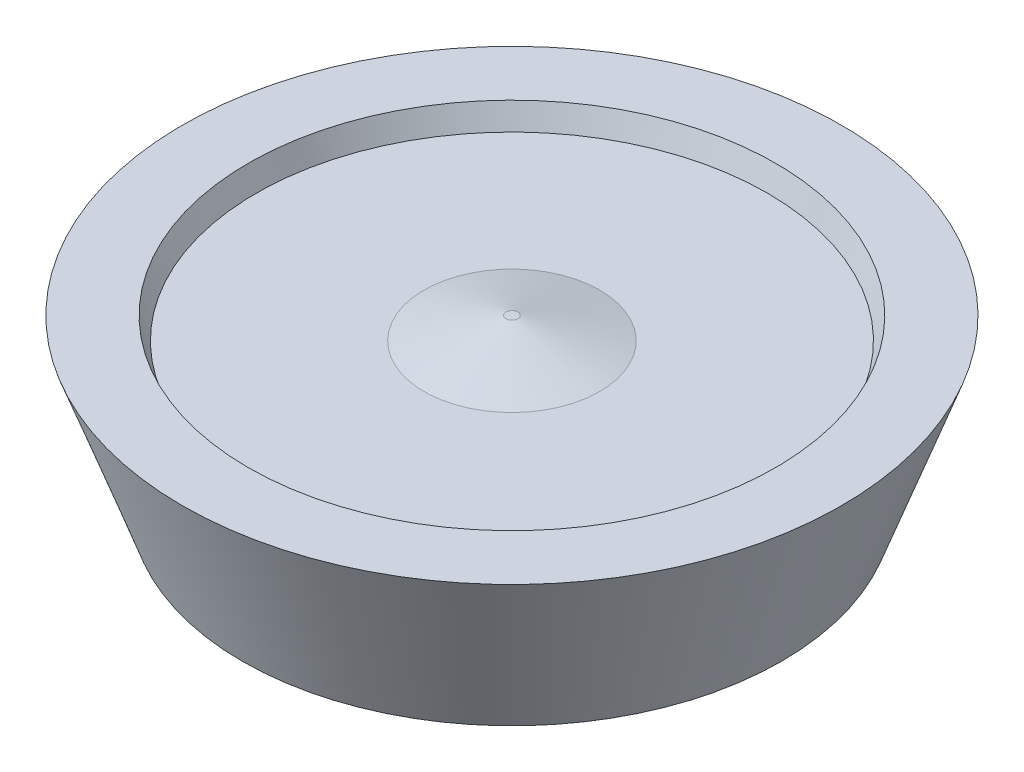
ISO-10303-21;
HEADER;
FILE_DESCRIPTION(('STEP AP214'),'2;1');
FILE_NAME('part.step','',(''),(''),'','','');
FILE_SCHEMA(('AUTOMOTIVE_DESIGN { 1 0 10303 214 1 1 1 1 }'));
ENDSEC;
DATA;
#1=APPLICATION_CONTEXT('core data for automotive mechanical design processes');
#2=APPLICATION_PROTOCOL_DEFINITION('international standard','automotive_design',2000,#1);
#3=PRODUCT_CONTEXT('',#1,'mechanical');
#4=PRODUCT('Part','Part','',(#3));
#5=PRODUCT_RELATED_PRODUCT_CATEGORY('part','',(#4));
#6=PRODUCT_DEFINITION_FORMATION('','',#4);
#7=PRODUCT_DEFINITION_CONTEXT('part definition',#1,'design');
#8=PRODUCT_DEFINITION('design','',#6,#7);
#9=PRODUCT_DEFINITION_SHAPE('','',#8);
#10=(LENGTH_UNIT() NAMED_UNIT(*) SI_UNIT(.MILLI.,.METRE.));
#11=(NAMED_UNIT(*) PLANE_ANGLE_UNIT() SI_UNIT($,.RADIAN.));
#12=(NAMED_UNIT(*) SI_UNIT($,.STERADIAN.) SOLID_ANGLE_UNIT());
#13=UNCERTAINTY_MEASURE_WITH_UNIT(LENGTH_MEASURE(1.E-05),#10,'distance_accuracy_value','');
#14=(GEOMETRIC_REPRESENTATION_CONTEXT(3) GLOBAL_UNCERTAINTY_ASSIGNED_CONTEXT((#13)) GLOBAL_UNIT_ASSIGNED_CONTEXT((#10,
#11,#12)) REPRESENTATION_CONTEXT('',''));
#15=CARTESIAN_POINT('',(0.,0.,0.));
#16=DIRECTION('',(0.,0.,1.));
#17=DIRECTION('',(1.,0.,0.));
#18=AXIS2_PLACEMENT_3D('',#15,#16,#17);
#19=CARTESIAN_POINT('',(0.,0.,0.));
#20=DIRECTION('',(0.,1.,0.));
#21=DIRECTION('',(0.,0.,1.));
#22=AXIS2_PLACEMENT_3D('',#19,#20,#21);
#23=CONICAL_SURFACE('',#22,30.,0.349065850398866);
#24=CARTESIAN_POINT('',(0.,-15.,0.));
#25=DIRECTION('',(0.,1.,0.));
#26=DIRECTION('',(0.,0.,1.));
#27=AXIS2_PLACEMENT_3D('',#24,#25,#26);
#28=CIRCLE('',#27,24.5404464860069);
#29=CARTESIAN_POINT('',(0.,-15.,24.5404464860069));
#30=VERTEX_POINT('',#29);
#31=EDGE_CURVE('E53',#30,#30,#28,.T.);
#32=ORIENTED_EDGE('',*,*,#31,.T.);
#33=EDGE_LOOP('',(#32));
#34=FACE_BOUND('',#33,.T.);
#35=CARTESIAN_POINT('',(0.,0.,0.));
#36=DIRECTION('',(0.,1.,0.));
#37=DIRECTION('',(0.,0.,1.));
#38=AXIS2_PLACEMENT_3D('',#35,#36,#37);
#39=CIRCLE('',#38,30.);
#40=CARTESIAN_POINT('',(0.,0.,30.));
#41=VERTEX_POINT('',#40);
#42=EDGE_CURVE('E10',#41,#41,#39,.T.);
#43=ORIENTED_EDGE('',*,*,#42,.F.);
#44=EDGE_LOOP('',(#43));
#45=FACE_BOUND('',#44,.T.);
#46=ADVANCED_FACE('F31',(#34,#45),#23,.T.);
#47=CARTESIAN_POINT('',(24.,0.,0.));
#48=DIRECTION('',(0.,1.,0.));
#49=DIRECTION('',(0.,0.,1.));
#50=AXIS2_PLACEMENT_3D('',#47,#48,#49);
#51=PLANE('',#50);
#52=ORIENTED_EDGE('',*,*,#42,.T.);
#53=EDGE_LOOP('',(#52));
#54=FACE_BOUND('',#53,.T.);
#55=CARTESIAN_POINT('',(0.,0.,0.));
#56=DIRECTION('',(0.,1.,0.));
#57=DIRECTION('',(0.,0.,1.));
#58=AXIS2_PLACEMENT_3D('',#55,#56,#57);
#59=CIRCLE('',#58,24.);
#60=CARTESIAN_POINT('',(0.,0.,24.));
#61=VERTEX_POINT('',#60);
#62=EDGE_CURVE('E37',#61,#61,#59,.T.);
#63=ORIENTED_EDGE('',*,*,#62,.F.);
#64=EDGE_LOOP('',(#63));
#65=FACE_BOUND('',#64,.T.);
#66=ADVANCED_FACE('F70',(#54,#65),#51,.T.);
#67=CARTESIAN_POINT('',(0.,-2.,0.));
#68=DIRECTION('',(0.,1.,0.));
#69=DIRECTION('',(0.,0.,1.));
#70=AXIS2_PLACEMENT_3D('',#67,#68,#69);
#71=CONICAL_SURFACE('',#70,23.2720595314676,0.349065850398867);
#72=ORIENTED_EDGE('',*,*,#62,.T.);
#73=EDGE_LOOP('',(#72));
#74=FACE_BOUND('',#73,.T.);
#75=CARTESIAN_POINT('',(0.,-2.,0.));
#76=DIRECTION('',(0.,1.,0.));
#77=DIRECTION('',(0.,0.,1.));
#78=AXIS2_PLACEMENT_3D('',#75,#76,#77);
#79=CIRCLE('',#78,23.2720595314676);
#80=CARTESIAN_POINT('',(0.,-2.,23.2720595314676));
#81=VERTEX_POINT('',#80);
#82=EDGE_CURVE('E41',#81,#81,#79,.T.);
#83=ORIENTED_EDGE('',*,*,#82,.F.);
#84=EDGE_LOOP('',(#83));
#85=FACE_BOUND('',#84,.T.);
#86=ADVANCED_FACE('F74',(#74,#85),#71,.F.);
#87=CARTESIAN_POINT('',(8.,-2.,0.));
#88=DIRECTION('',(0.,1.,0.));
#89=DIRECTION('',(0.,0.,1.));
#90=AXIS2_PLACEMENT_3D('',#87,#88,#89);
#91=PLANE('',#90);
#92=ORIENTED_EDGE('',*,*,#82,.T.);
#93=EDGE_LOOP('',(#92));
#94=FACE_BOUND('',#93,.T.);
#95=CARTESIAN_POINT('',(0.,-2.,0.));
#96=DIRECTION('',(0.,1.,0.));
#97=DIRECTION('',(0.,0.,1.));
#98=AXIS2_PLACEMENT_3D('',#95,#96,#97);
#99=CIRCLE('',#98,8.);
#100=CARTESIAN_POINT('',(0.,-2.,-8.));
#101=VERTEX_POINT('',#100);
#102=EDGE_CURVE('E45',#101,#101,#99,.T.);
#103=ORIENTED_EDGE('',*,*,#102,.F.);
#104=EDGE_LOOP('',(#103));
#105=FACE_BOUND('',#104,.T.);
#106=ADVANCED_FACE('F78',(#94,#105),#91,.T.);
#107=CARTESIAN_POINT('',(0.,0.,0.));
#108=DIRECTION('',(0.,-1.,0.));
#109=DIRECTION('',(0.,0.,-1.));
#110=AXIS2_PLACEMENT_3D('',#107,#108,#109);
#111=CONICAL_SURFACE('',#110,0.535898384862157,1.30899693899575);
#112=CARTESIAN_POINT('',(0.,0.,0.));
#113=DIRECTION('',(0.,1.,0.));
#114=DIRECTION('',(0.,0.,1.));
#115=AXIS2_PLACEMENT_3D('',#112,#113,#114);
#116=CIRCLE('',#115,0.535898384862157);
#117=CARTESIAN_POINT('',(0.,0.,-0.535898384862157));
#118=VERTEX_POINT('',#117);
#119=EDGE_CURVE('E50',#118,#118,#116,.T.);
#120=CARTESIAN_POINT('',(0.,-2.,-8.));
#121=CARTESIAN_POINT('',(0.,-1.97916666666667,-7.92224894150898));
#122=CARTESIAN_POINT('',(0.,-1.95833333333333,-7.84449788301796));
#123=CARTESIAN_POINT('',(0.,-1.91666666666667,-7.68899576603592));
#124=CARTESIAN_POINT('',(0.,-1.89583333333333,-7.6112447075449));
#125=CARTESIAN_POINT('',(0.,-1.85416666666667,-7.45574259056286));
#126=CARTESIAN_POINT('',(0.,-1.83333333333333,-7.37799153207184));
#127=CARTESIAN_POINT('',(0.,-1.79166666666667,-7.22248941508981));
#128=CARTESIAN_POINT('',(0.,-1.77083333333333,-7.14473835659879));
#129=CARTESIAN_POINT('',(0.,-1.72916666666667,-6.98923623961675));
#130=CARTESIAN_POINT('',(0.,-1.70833333333333,-6.91148518112573));
#131=CARTESIAN_POINT('',(0.,-1.66666666666667,-6.75598306414369));
#132=CARTESIAN_POINT('',(0.,-1.64583333333333,-6.67823200565267));
#133=CARTESIAN_POINT('',(0.,-1.60416666666667,-6.52272988867063));
#134=CARTESIAN_POINT('',(0.,-1.58333333333333,-6.44497883017961));
#135=CARTESIAN_POINT('',(0.,-1.54166666666667,-6.28947671319758));
#136=CARTESIAN_POINT('',(0.,-1.52083333333333,-6.21172565470656));
#137=CARTESIAN_POINT('',(0.,-1.47916666666667,-6.05622353772452));
#138=CARTESIAN_POINT('',(0.,-1.45833333333333,-5.9784724792335));
#139=CARTESIAN_POINT('',(0.,-1.41666666666667,-5.82297036225146));
#140=CARTESIAN_POINT('',(0.,-1.39583333333333,-5.74521930376044));
#141=CARTESIAN_POINT('',(0.,-1.35416666666667,-5.5897171867784));
#142=CARTESIAN_POINT('',(0.,-1.33333333333333,-5.51196612828738));
#143=CARTESIAN_POINT('',(0.,-1.29166666666667,-5.35646401130535));
#144=CARTESIAN_POINT('',(0.,-1.27083333333333,-5.27871295281433));
#145=CARTESIAN_POINT('',(0.,-1.22916666666667,-5.12321083583229));
#146=CARTESIAN_POINT('',(0.,-1.20833333333333,-5.04545977734127));
#147=CARTESIAN_POINT('',(0.,-1.16666666666667,-4.88995766035923));
#148=CARTESIAN_POINT('',(0.,-1.14583333333333,-4.81220660186821));
#149=CARTESIAN_POINT('',(0.,-1.10416666666667,-4.65670448488617));
#150=CARTESIAN_POINT('',(0.,-1.08333333333333,-4.57895342639516));
#151=CARTESIAN_POINT('',(0.,-1.04166666666667,-4.42345130941312));
#152=CARTESIAN_POINT('',(0.,-1.02083333333333,-4.3457002509221));
#153=CARTESIAN_POINT('',(0.,-0.979166666666667,-4.19019813394006));
#154=CARTESIAN_POINT('',(0.,-0.958333333333333,-4.11244707544904));
#155=CARTESIAN_POINT('',(0.,-0.916666666666667,-3.956944958467));
#156=CARTESIAN_POINT('',(0.,-0.895833333333333,-3.87919389997598));
#157=CARTESIAN_POINT('',(0.,-0.854166666666667,-3.72369178299394));
#158=CARTESIAN_POINT('',(0.,-0.833333333333333,-3.64594072450292));
#159=CARTESIAN_POINT('',(0.,-0.791666666666667,-3.49043860752089));
#160=CARTESIAN_POINT('',(0.,-0.770833333333333,-3.41268754902987));
#161=CARTESIAN_POINT('',(0.,-0.729166666666667,-3.25718543204783));
#162=CARTESIAN_POINT('',(0.,-0.708333333333333,-3.17943437355681));
#163=CARTESIAN_POINT('',(0.,-0.666666666666667,-3.02393225657477));
#164=CARTESIAN_POINT('',(0.,-0.645833333333333,-2.94618119808375));
#165=CARTESIAN_POINT('',(0.,-0.604166666666667,-2.79067908110171));
#166=CARTESIAN_POINT('',(0.,-0.583333333333333,-2.71292802261069));
#167=CARTESIAN_POINT('',(0.,-0.541666666666667,-2.55742590562866));
#168=CARTESIAN_POINT('',(0.,-0.520833333333333,-2.47967484713764));
#169=CARTESIAN_POINT('',(0.,-0.479166666666667,-2.3241727301556));
#170=CARTESIAN_POINT('',(0.,-0.458333333333333,-2.24642167166458));
#171=CARTESIAN_POINT('',(0.,-0.416666666666667,-2.09091955468254));
#172=CARTESIAN_POINT('',(0.,-0.395833333333333,-2.01316849619152));
#173=CARTESIAN_POINT('',(0.,-0.354166666666667,-1.85766637920948));
#174=CARTESIAN_POINT('',(0.,-0.333333333333333,-1.77991532071846));
#175=CARTESIAN_POINT('',(0.,-0.291666666666667,-1.62441320373643));
#176=CARTESIAN_POINT('',(0.,-0.270833333333333,-1.54666214524541));
#177=CARTESIAN_POINT('',(0.,-0.229166666666667,-1.39116002826337));
#178=CARTESIAN_POINT('',(0.,-0.208333333333333,-1.31340896977235));
#179=CARTESIAN_POINT('',(0.,-0.166666666666667,-1.15790685279031));
#180=CARTESIAN_POINT('',(0.,-0.145833333333333,-1.08015579429929));
#181=CARTESIAN_POINT('',(0.,-0.104166666666667,-0.924653677317253));
#182=CARTESIAN_POINT('',(0.,-0.0833333333333334,-0.846902618826234));
#183=CARTESIAN_POINT('',(0.,-0.0416666666666667,-0.691400501844195));
#184=CARTESIAN_POINT('',(0.,-0.0208333333333333,-0.613649443353176));
#185=CARTESIAN_POINT('',(0.,0.,-0.535898384862157));
#186=B_SPLINE_CURVE_WITH_KNOTS('',3,(#120,#121,#122,#123,#124,#125,#126,#127,#128,#129,#130,
#131,#132,#133,#134,#135,#136,#137,#138,#139,#140,#141,#142,#143,#144,#145,#146,#147,#148,#149,
#150,#151,#152,#153,#154,#155,#156,#157,#158,#159,#160,#161,#162,#163,#164,#165,#166,#167,#168,
#169,#170,#171,#172,#173,#174,#175,#176,#177,#178,#179,#180,#181,#182,#183,#184,#185),
.UNSPECIFIED.,.F.,.F.,(4,2,2,2,2,2,2,2,2,2,2,2,2,2,2,2,2,2,2,2,2,2,2,2,2,2,2,2,2,2,2,2,4),(0.,
0.24148145657227,0.48296291314454,0.724444369716809,0.965925826289079,1.20740728286135,
1.44888873943362,1.69037019600589,1.93185165257816,2.17333310915043,2.4148145657227,
2.65629602229497,2.89777747886724,3.13925893543951,3.38074039201178,3.62222184858405,
3.86370330515632,4.10518476172859,4.34666621830086,4.58814767487313,4.8296291314454,
5.07111058801767,5.31259204458993,5.5540735011622,5.79555495773447,6.03703641430674,
6.27851787087901,6.51999932745128,6.76148078402355,7.00296224059582,7.24444369716809,
7.48592515374036,7.72740661031263),.UNSPECIFIED.);
#187=EDGE_CURVE('BSEAM66',#101,#118,#186,.T.);
#188=ORIENTED_EDGE('',*,*,#102,.T.);
#189=ORIENTED_EDGE('',*,*,#119,.F.);
#190=ORIENTED_EDGE('',*,*,#187,.T.);
#191=ORIENTED_EDGE('',*,*,#187,.F.);
#192=EDGE_LOOP('',(#188,#190,#189,#191));
#193=FACE_BOUND('',#192,.T.);
#194=ADVANCED_FACE('F66',(#193),#111,.T.);
#195=CARTESIAN_POINT('',(0.,0.,0.));
#196=DIRECTION('',(0.,1.,0.));
#197=DIRECTION('',(0.,0.,1.));
#198=AXIS2_PLACEMENT_3D('',#195,#196,#197);
#199=PLANE('',#198);
#200=ORIENTED_EDGE('',*,*,#119,.T.);
#201=EDGE_LOOP('',(#200));
#202=FACE_BOUND('',#201,.T.);
#203=ADVANCED_FACE('F61',(#202),#199,.T.);
#204=CARTESIAN_POINT('',(24.5404464860069,-15.,0.));
#205=DIRECTION('',(0.,-1.,0.));
#206=DIRECTION('',(0.,0.,-1.));
#207=AXIS2_PLACEMENT_3D('',#204,#205,#206);
#208=PLANE('',#207);
#209=ORIENTED_EDGE('',*,*,#31,.F.);
#210=EDGE_LOOP('',(#209));
#211=FACE_BOUND('',#210,.T.);
#212=ADVANCED_FACE('F59',(#211),#208,.T.);
#213=CLOSED_SHELL('',(#46,#66,#86,#106,#194,#203,#212));
#214=MANIFOLD_SOLID_BREP('B2',#213);
#215=ADVANCED_BREP_SHAPE_REPRESENTATION('',(#18,#214),#14);
#216=SHAPE_DEFINITION_REPRESENTATION(#9,#215);
ENDSEC;
END-ISO-10303-21;
